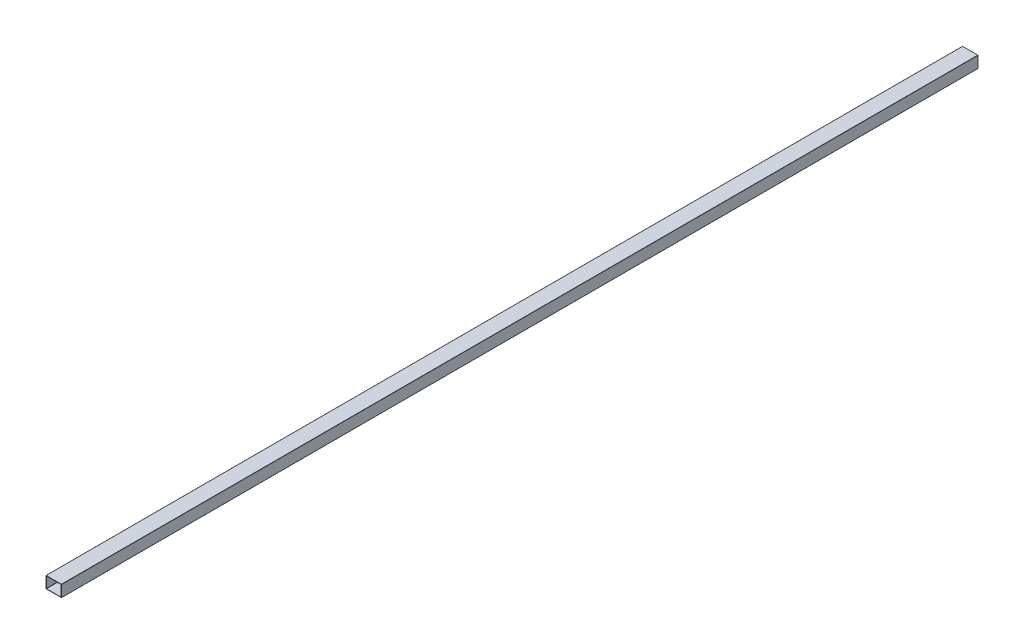
ISO-10303-21;
HEADER;
FILE_DESCRIPTION(('STEP AP214'),'2;1');
FILE_NAME('part.step','',(''),(''),'','','');
FILE_SCHEMA(('AUTOMOTIVE_DESIGN { 1 0 10303 214 1 1 1 1 }'));
ENDSEC;
DATA;
#1=APPLICATION_CONTEXT('core data for automotive mechanical design processes');
#2=APPLICATION_PROTOCOL_DEFINITION('international standard','automotive_design',2000,#1);
#3=PRODUCT_CONTEXT('',#1,'mechanical');
#4=PRODUCT('Part','Part','',(#3));
#5=PRODUCT_RELATED_PRODUCT_CATEGORY('part','',(#4));
#6=PRODUCT_DEFINITION_FORMATION('','',#4);
#7=PRODUCT_DEFINITION_CONTEXT('part definition',#1,'design');
#8=PRODUCT_DEFINITION('design','',#6,#7);
#9=PRODUCT_DEFINITION_SHAPE('','',#8);
#10=(LENGTH_UNIT() NAMED_UNIT(*) SI_UNIT(.MILLI.,.METRE.));
#11=(NAMED_UNIT(*) PLANE_ANGLE_UNIT() SI_UNIT($,.RADIAN.));
#12=(NAMED_UNIT(*) SI_UNIT($,.STERADIAN.) SOLID_ANGLE_UNIT());
#13=UNCERTAINTY_MEASURE_WITH_UNIT(LENGTH_MEASURE(1.E-05),#10,'distance_accuracy_value','');
#14=(GEOMETRIC_REPRESENTATION_CONTEXT(3) GLOBAL_UNCERTAINTY_ASSIGNED_CONTEXT((#13)) GLOBAL_UNIT_ASSIGNED_CONTEXT((#10,
#11,#12)) REPRESENTATION_CONTEXT('',''));
#15=CARTESIAN_POINT('',(0.,0.,0.));
#16=DIRECTION('',(0.,0.,1.));
#17=DIRECTION('',(1.,0.,0.));
#18=AXIS2_PLACEMENT_3D('',#15,#16,#17);
#19=CARTESIAN_POINT('',(50.8,-38.1,-6000.));
#20=DIRECTION('',(1.,0.,0.));
#21=DIRECTION('',(0.,0.,-1.));
#22=AXIS2_PLACEMENT_3D('',#19,#20,#21);
#23=PLANE('',#22);
#24=DIRECTION('',(0.,1.,0.));
#25=VECTOR('',#24,1.);
#26=CARTESIAN_POINT('',(50.8,-38.1,0.));
#27=LINE('',#26,#25);
#28=CARTESIAN_POINT('',(50.8,-37.1,0.));
#29=VERTEX_POINT('',#28);
#30=CARTESIAN_POINT('',(50.8,37.1,0.));
#31=VERTEX_POINT('',#30);
#32=EDGE_CURVE('E197',#29,#31,#27,.T.);
#33=ORIENTED_EDGE('',*,*,#32,.F.);
#34=DIRECTION('',(0.,0.,1.));
#35=VECTOR('',#34,1.);
#36=CARTESIAN_POINT('',(50.8,-37.1,-6000.));
#37=LINE('',#36,#35);
#38=CARTESIAN_POINT('',(50.8,-37.1,-6000.));
#39=VERTEX_POINT('',#38);
#40=EDGE_CURVE('E158',#29,#39,#37,.F.);
#41=ORIENTED_EDGE('',*,*,#40,.T.);
#42=DIRECTION('',(0.,1.,0.));
#43=VECTOR('',#42,1.);
#44=CARTESIAN_POINT('',(50.8,-38.1,-6000.));
#45=LINE('',#44,#43);
#46=CARTESIAN_POINT('',(50.8,37.1,-6000.));
#47=VERTEX_POINT('',#46);
#48=EDGE_CURVE('E185',#39,#47,#45,.T.);
#49=ORIENTED_EDGE('',*,*,#48,.T.);
#50=DIRECTION('',(0.,0.,1.));
#51=VECTOR('',#50,1.);
#52=CARTESIAN_POINT('',(50.8,37.1,-6000.));
#53=LINE('',#52,#51);
#54=EDGE_CURVE('E251',#47,#31,#53,.T.);
#55=ORIENTED_EDGE('',*,*,#54,.T.);
#56=EDGE_LOOP('',(#33,#41,#49,#55));
#57=FACE_BOUND('',#56,.T.);
#58=ADVANCED_FACE('F33',(#57),#23,.T.);
#59=CARTESIAN_POINT('',(-50.8,-38.1,-6000.));
#60=DIRECTION('',(0.,-1.,0.));
#61=DIRECTION('',(0.,0.,-1.));
#62=AXIS2_PLACEMENT_3D('',#59,#60,#61);
#63=PLANE('',#62);
#64=DIRECTION('',(1.,0.,0.));
#65=VECTOR('',#64,1.);
#66=CARTESIAN_POINT('',(-50.8,-38.1,0.));
#67=LINE('',#66,#65);
#68=CARTESIAN_POINT('',(-49.8,-38.1,0.));
#69=VERTEX_POINT('',#68);
#70=CARTESIAN_POINT('',(49.8,-38.1,0.));
#71=VERTEX_POINT('',#70);
#72=EDGE_CURVE('E189',#69,#71,#67,.T.);
#73=ORIENTED_EDGE('',*,*,#72,.F.);
#74=DIRECTION('',(0.,0.,1.));
#75=VECTOR('',#74,1.);
#76=CARTESIAN_POINT('',(-49.8,-38.1,-6000.));
#77=LINE('',#76,#75);
#78=CARTESIAN_POINT('',(-49.8,-38.1,-6000.));
#79=VERTEX_POINT('',#78);
#80=EDGE_CURVE('E238',#69,#79,#77,.F.);
#81=ORIENTED_EDGE('',*,*,#80,.T.);
#82=DIRECTION('',(1.,0.,0.));
#83=VECTOR('',#82,1.);
#84=CARTESIAN_POINT('',(-50.8,-38.1,-6000.));
#85=LINE('',#84,#83);
#86=CARTESIAN_POINT('',(49.8,-38.1,-6000.));
#87=VERTEX_POINT('',#86);
#88=EDGE_CURVE('E194',#79,#87,#85,.T.);
#89=ORIENTED_EDGE('',*,*,#88,.T.);
#90=DIRECTION('',(0.,0.,1.));
#91=VECTOR('',#90,1.);
#92=CARTESIAN_POINT('',(49.8,-38.1,-6000.));
#93=LINE('',#92,#91);
#94=EDGE_CURVE('E235',#87,#71,#93,.T.);
#95=ORIENTED_EDGE('',*,*,#94,.T.);
#96=EDGE_LOOP('',(#73,#81,#89,#95));
#97=FACE_BOUND('',#96,.T.);
#98=ADVANCED_FACE('F305',(#97),#63,.T.);
#99=CARTESIAN_POINT('',(-50.8,-38.1,-6000.));
#100=DIRECTION('',(-1.,0.,0.));
#101=DIRECTION('',(0.,0.,1.));
#102=AXIS2_PLACEMENT_3D('',#99,#100,#101);
#103=PLANE('',#102);
#104=DIRECTION('',(0.,-1.,0.));
#105=VECTOR('',#104,1.);
#106=CARTESIAN_POINT('',(-50.8,-38.1,-6000.));
#107=LINE('',#106,#105);
#108=CARTESIAN_POINT('',(-50.8,37.1,-6000.));
#109=VERTEX_POINT('',#108);
#110=CARTESIAN_POINT('',(-50.8,-37.1,-6000.));
#111=VERTEX_POINT('',#110);
#112=EDGE_CURVE('E191',#109,#111,#107,.T.);
#113=ORIENTED_EDGE('',*,*,#112,.T.);
#114=DIRECTION('',(0.,0.,1.));
#115=VECTOR('',#114,1.);
#116=CARTESIAN_POINT('',(-50.8,-37.1,-6000.));
#117=LINE('',#116,#115);
#118=CARTESIAN_POINT('',(-50.8,-37.1,0.));
#119=VERTEX_POINT('',#118);
#120=EDGE_CURVE('E224',#111,#119,#117,.T.);
#121=ORIENTED_EDGE('',*,*,#120,.T.);
#122=DIRECTION('',(0.,-1.,0.));
#123=VECTOR('',#122,1.);
#124=CARTESIAN_POINT('',(-50.8,-38.1,0.));
#125=LINE('',#124,#123);
#126=CARTESIAN_POINT('',(-50.8,37.1,0.));
#127=VERTEX_POINT('',#126);
#128=EDGE_CURVE('E203',#127,#119,#125,.T.);
#129=ORIENTED_EDGE('',*,*,#128,.F.);
#130=DIRECTION('',(0.,0.,1.));
#131=VECTOR('',#130,1.);
#132=CARTESIAN_POINT('',(-50.8,37.1,-6000.));
#133=LINE('',#132,#131);
#134=EDGE_CURVE('E222',#127,#109,#133,.F.);
#135=ORIENTED_EDGE('',*,*,#134,.T.);
#136=EDGE_LOOP('',(#113,#121,#129,#135));
#137=FACE_BOUND('',#136,.T.);
#138=ADVANCED_FACE('F311',(#137),#103,.T.);
#139=CARTESIAN_POINT('',(-50.8,38.1,-6000.));
#140=DIRECTION('',(0.,1.,0.));
#141=DIRECTION('',(0.,0.,1.));
#142=AXIS2_PLACEMENT_3D('',#139,#140,#141);
#143=PLANE('',#142);
#144=DIRECTION('',(-1.,0.,0.));
#145=VECTOR('',#144,1.);
#146=CARTESIAN_POINT('',(-50.8,38.1,-6000.));
#147=LINE('',#146,#145);
#148=CARTESIAN_POINT('',(49.8,38.1,-6000.));
#149=VERTEX_POINT('',#148);
#150=CARTESIAN_POINT('',(-49.8,38.1,-6000.));
#151=VERTEX_POINT('',#150);
#152=EDGE_CURVE('E188',#149,#151,#147,.T.);
#153=ORIENTED_EDGE('',*,*,#152,.T.);
#154=DIRECTION('',(0.,0.,1.));
#155=VECTOR('',#154,1.);
#156=CARTESIAN_POINT('',(-49.8,38.1,-6000.));
#157=LINE('',#156,#155);
#158=CARTESIAN_POINT('',(-49.8,38.1,0.));
#159=VERTEX_POINT('',#158);
#160=EDGE_CURVE('E248',#151,#159,#157,.T.);
#161=ORIENTED_EDGE('',*,*,#160,.T.);
#162=DIRECTION('',(-1.,0.,0.));
#163=VECTOR('',#162,1.);
#164=CARTESIAN_POINT('',(-50.8,38.1,0.));
#165=LINE('',#164,#163);
#166=CARTESIAN_POINT('',(49.8,38.1,0.));
#167=VERTEX_POINT('',#166);
#168=EDGE_CURVE('E200',#167,#159,#165,.T.);
#169=ORIENTED_EDGE('',*,*,#168,.F.);
#170=DIRECTION('',(0.,0.,1.));
#171=VECTOR('',#170,1.);
#172=CARTESIAN_POINT('',(49.8,38.1,-6000.));
#173=LINE('',#172,#171);
#174=EDGE_CURVE('E55',#167,#149,#173,.F.);
#175=ORIENTED_EDGE('',*,*,#174,.T.);
#176=EDGE_LOOP('',(#153,#161,#169,#175));
#177=FACE_BOUND('',#176,.T.);
#178=ADVANCED_FACE('F316',(#177),#143,.T.);
#179=CARTESIAN_POINT('',(0.,0.,-6000.));
#180=DIRECTION('',(0.,0.,-1.));
#181=DIRECTION('',(-1.,0.,0.));
#182=AXIS2_PLACEMENT_3D('',#179,#180,#181);
#183=PLANE('',#182);
#184=DIRECTION('',(0.,-1.,0.));
#185=VECTOR('',#184,1.);
#186=CARTESIAN_POINT('',(-48.91,-36.21,-6000.));
#187=LINE('',#186,#185);
#188=CARTESIAN_POINT('',(-48.91,35.21,-6000.));
#189=VERTEX_POINT('',#188);
#190=CARTESIAN_POINT('',(-48.91,-35.21,-6000.));
#191=VERTEX_POINT('',#190);
#192=EDGE_CURVE('E167',#189,#191,#187,.T.);
#193=ORIENTED_EDGE('',*,*,#192,.T.);
#194=CARTESIAN_POINT('',(-47.91,-35.21,-6000.));
#195=DIRECTION('',(0.,0.,-1.));
#196=DIRECTION('',(-1.,0.,0.));
#197=AXIS2_PLACEMENT_3D('',#194,#195,#196);
#198=CIRCLE('',#197,1.);
#199=CARTESIAN_POINT('',(-47.91,-36.21,-6000.));
#200=VERTEX_POINT('',#199);
#201=EDGE_CURVE('E11',#191,#200,#198,.F.);
#202=ORIENTED_EDGE('',*,*,#201,.T.);
#203=DIRECTION('',(1.,0.,0.));
#204=VECTOR('',#203,1.);
#205=CARTESIAN_POINT('',(-48.91,-36.21,-6000.));
#206=LINE('',#205,#204);
#207=CARTESIAN_POINT('',(47.91,-36.21,-6000.));
#208=VERTEX_POINT('',#207);
#209=EDGE_CURVE('E175',#200,#208,#206,.T.);
#210=ORIENTED_EDGE('',*,*,#209,.T.);
#211=CARTESIAN_POINT('',(47.91,-35.21,-6000.));
#212=DIRECTION('',(0.,0.,-1.));
#213=DIRECTION('',(-1.,0.,0.));
#214=AXIS2_PLACEMENT_3D('',#211,#212,#213);
#215=CIRCLE('',#214,1.);
#216=CARTESIAN_POINT('',(48.91,-35.21,-6000.));
#217=VERTEX_POINT('',#216);
#218=EDGE_CURVE('E262',#208,#217,#215,.F.);
#219=ORIENTED_EDGE('',*,*,#218,.T.);
#220=DIRECTION('',(0.,1.,0.));
#221=VECTOR('',#220,1.);
#222=CARTESIAN_POINT('',(48.91,-36.21,-6000.));
#223=LINE('',#222,#221);
#224=CARTESIAN_POINT('',(48.91,35.21,-6000.));
#225=VERTEX_POINT('',#224);
#226=EDGE_CURVE('E179',#217,#225,#223,.T.);
#227=ORIENTED_EDGE('',*,*,#226,.T.);
#228=CARTESIAN_POINT('',(47.91,35.21,-6000.));
#229=DIRECTION('',(0.,0.,-1.));
#230=DIRECTION('',(-1.,0.,0.));
#231=AXIS2_PLACEMENT_3D('',#228,#229,#230);
#232=CIRCLE('',#231,1.);
#233=CARTESIAN_POINT('',(47.91,36.21,-6000.));
#234=VERTEX_POINT('',#233);
#235=EDGE_CURVE('E258',#225,#234,#232,.F.);
#236=ORIENTED_EDGE('',*,*,#235,.T.);
#237=DIRECTION('',(-1.,0.,0.));
#238=VECTOR('',#237,1.);
#239=CARTESIAN_POINT('',(-48.91,36.21,-6000.));
#240=LINE('',#239,#238);
#241=CARTESIAN_POINT('',(-47.91,36.21,-6000.));
#242=VERTEX_POINT('',#241);
#243=EDGE_CURVE('E277',#234,#242,#240,.T.);
#244=ORIENTED_EDGE('',*,*,#243,.T.);
#245=CARTESIAN_POINT('',(-47.91,35.21,-6000.));
#246=DIRECTION('',(0.,0.,-1.));
#247=DIRECTION('',(-1.,0.,0.));
#248=AXIS2_PLACEMENT_3D('',#245,#246,#247);
#249=CIRCLE('',#248,1.);
#250=EDGE_CURVE('E157',#242,#189,#249,.F.);
#251=ORIENTED_EDGE('',*,*,#250,.T.);
#252=EDGE_LOOP('',(#193,#202,#210,#219,#227,#236,#244,#251));
#253=FACE_BOUND('',#252,.T.);
#254=ORIENTED_EDGE('',*,*,#88,.F.);
#255=CARTESIAN_POINT('',(-49.8,-37.1,-6000.));
#256=DIRECTION('',(0.,0.,-1.));
#257=DIRECTION('',(-1.,0.,0.));
#258=AXIS2_PLACEMENT_3D('',#255,#256,#257);
#259=CIRCLE('',#258,1.);
#260=EDGE_CURVE('E245',#79,#111,#259,.T.);
#261=ORIENTED_EDGE('',*,*,#260,.T.);
#262=ORIENTED_EDGE('',*,*,#112,.F.);
#263=CARTESIAN_POINT('',(-49.8,37.1,-6000.));
#264=DIRECTION('',(0.,0.,-1.));
#265=DIRECTION('',(-1.,0.,0.));
#266=AXIS2_PLACEMENT_3D('',#263,#264,#265);
#267=CIRCLE('',#266,1.);
#268=EDGE_CURVE('E48',#109,#151,#267,.T.);
#269=ORIENTED_EDGE('',*,*,#268,.T.);
#270=ORIENTED_EDGE('',*,*,#152,.F.);
#271=CARTESIAN_POINT('',(49.8,37.1,-6000.));
#272=DIRECTION('',(0.,0.,-1.));
#273=DIRECTION('',(-1.,0.,0.));
#274=AXIS2_PLACEMENT_3D('',#271,#272,#273);
#275=CIRCLE('',#274,1.);
#276=EDGE_CURVE('E240',#149,#47,#275,.T.);
#277=ORIENTED_EDGE('',*,*,#276,.T.);
#278=ORIENTED_EDGE('',*,*,#48,.F.);
#279=CARTESIAN_POINT('',(49.8,-37.1,-6000.));
#280=DIRECTION('',(0.,0.,-1.));
#281=DIRECTION('',(-1.,0.,0.));
#282=AXIS2_PLACEMENT_3D('',#279,#280,#281);
#283=CIRCLE('',#282,1.);
#284=EDGE_CURVE('E242',#39,#87,#283,.T.);
#285=ORIENTED_EDGE('',*,*,#284,.T.);
#286=EDGE_LOOP('',(#254,#261,#262,#269,#270,#277,#278,#285));
#287=FACE_BOUND('',#286,.T.);
#288=ADVANCED_FACE('F267',(#253,#287),#183,.T.);
#289=CARTESIAN_POINT('',(0.,0.,0.));
#290=DIRECTION('',(0.,0.,-1.));
#291=DIRECTION('',(-1.,0.,0.));
#292=AXIS2_PLACEMENT_3D('',#289,#290,#291);
#293=PLANE('',#292);
#294=DIRECTION('',(0.,1.,0.));
#295=VECTOR('',#294,1.);
#296=CARTESIAN_POINT('',(48.91,-36.21,0.));
#297=LINE('',#296,#295);
#298=CARTESIAN_POINT('',(48.91,-35.21,0.));
#299=VERTEX_POINT('',#298);
#300=CARTESIAN_POINT('',(48.91,35.21,0.));
#301=VERTEX_POINT('',#300);
#302=EDGE_CURVE('E181',#299,#301,#297,.T.);
#303=ORIENTED_EDGE('',*,*,#302,.F.);
#304=CARTESIAN_POINT('',(47.91,-35.21,0.));
#305=DIRECTION('',(0.,0.,-1.));
#306=DIRECTION('',(-1.,0.,0.));
#307=AXIS2_PLACEMENT_3D('',#304,#305,#306);
#308=CIRCLE('',#307,1.);
#309=CARTESIAN_POINT('',(47.91,-36.21,0.));
#310=VERTEX_POINT('',#309);
#311=EDGE_CURVE('E260',#299,#310,#308,.T.);
#312=ORIENTED_EDGE('',*,*,#311,.T.);
#313=DIRECTION('',(1.,0.,0.));
#314=VECTOR('',#313,1.);
#315=CARTESIAN_POINT('',(-48.91,-36.21,0.));
#316=LINE('',#315,#314);
#317=CARTESIAN_POINT('',(-47.91,-36.21,0.));
#318=VERTEX_POINT('',#317);
#319=EDGE_CURVE('E281',#318,#310,#316,.T.);
#320=ORIENTED_EDGE('',*,*,#319,.F.);
#321=CARTESIAN_POINT('',(-47.91,-35.21,0.));
#322=DIRECTION('',(0.,0.,-1.));
#323=DIRECTION('',(-1.,0.,0.));
#324=AXIS2_PLACEMENT_3D('',#321,#322,#323);
#325=CIRCLE('',#324,1.);
#326=CARTESIAN_POINT('',(-48.91,-35.21,0.));
#327=VERTEX_POINT('',#326);
#328=EDGE_CURVE('E41',#318,#327,#325,.T.);
#329=ORIENTED_EDGE('',*,*,#328,.T.);
#330=DIRECTION('',(0.,-1.,0.));
#331=VECTOR('',#330,1.);
#332=CARTESIAN_POINT('',(-48.91,-36.21,0.));
#333=LINE('',#332,#331);
#334=CARTESIAN_POINT('',(-48.91,35.21,0.));
#335=VERTEX_POINT('',#334);
#336=EDGE_CURVE('E164',#335,#327,#333,.T.);
#337=ORIENTED_EDGE('',*,*,#336,.F.);
#338=CARTESIAN_POINT('',(-47.91,35.21,0.));
#339=DIRECTION('',(0.,0.,-1.));
#340=DIRECTION('',(-1.,0.,0.));
#341=AXIS2_PLACEMENT_3D('',#338,#339,#340);
#342=CIRCLE('',#341,1.);
#343=CARTESIAN_POINT('',(-47.91,36.21,0.));
#344=VERTEX_POINT('',#343);
#345=EDGE_CURVE('E147',#335,#344,#342,.T.);
#346=ORIENTED_EDGE('',*,*,#345,.T.);
#347=DIRECTION('',(-1.,0.,0.));
#348=VECTOR('',#347,1.);
#349=CARTESIAN_POINT('',(-48.91,36.21,0.));
#350=LINE('',#349,#348);
#351=CARTESIAN_POINT('',(47.91,36.21,0.));
#352=VERTEX_POINT('',#351);
#353=EDGE_CURVE('E176',#352,#344,#350,.T.);
#354=ORIENTED_EDGE('',*,*,#353,.F.);
#355=CARTESIAN_POINT('',(47.91,35.21,0.));
#356=DIRECTION('',(0.,0.,-1.));
#357=DIRECTION('',(-1.,0.,0.));
#358=AXIS2_PLACEMENT_3D('',#355,#356,#357);
#359=CIRCLE('',#358,1.);
#360=EDGE_CURVE('E256',#352,#301,#359,.T.);
#361=ORIENTED_EDGE('',*,*,#360,.T.);
#362=EDGE_LOOP('',(#303,#312,#320,#329,#337,#346,#354,#361));
#363=FACE_BOUND('',#362,.T.);
#364=ORIENTED_EDGE('',*,*,#128,.T.);
#365=CARTESIAN_POINT('',(-49.8,-37.1,0.));
#366=DIRECTION('',(0.,0.,-1.));
#367=DIRECTION('',(-1.,0.,0.));
#368=AXIS2_PLACEMENT_3D('',#365,#366,#367);
#369=CIRCLE('',#368,1.);
#370=EDGE_CURVE('E233',#119,#69,#369,.F.);
#371=ORIENTED_EDGE('',*,*,#370,.T.);
#372=ORIENTED_EDGE('',*,*,#72,.T.);
#373=CARTESIAN_POINT('',(49.8,-37.1,0.));
#374=DIRECTION('',(0.,0.,-1.));
#375=DIRECTION('',(-1.,0.,0.));
#376=AXIS2_PLACEMENT_3D('',#373,#374,#375);
#377=CIRCLE('',#376,1.);
#378=EDGE_CURVE('E229',#71,#29,#377,.F.);
#379=ORIENTED_EDGE('',*,*,#378,.T.);
#380=ORIENTED_EDGE('',*,*,#32,.T.);
#381=CARTESIAN_POINT('',(49.8,37.1,0.));
#382=DIRECTION('',(0.,0.,-1.));
#383=DIRECTION('',(-1.,0.,0.));
#384=AXIS2_PLACEMENT_3D('',#381,#382,#383);
#385=CIRCLE('',#384,1.);
#386=EDGE_CURVE('E227',#31,#167,#385,.F.);
#387=ORIENTED_EDGE('',*,*,#386,.T.);
#388=ORIENTED_EDGE('',*,*,#168,.T.);
#389=CARTESIAN_POINT('',(-49.8,37.1,0.));
#390=DIRECTION('',(0.,0.,-1.));
#391=DIRECTION('',(-1.,0.,0.));
#392=AXIS2_PLACEMENT_3D('',#389,#390,#391);
#393=CIRCLE('',#392,1.);
#394=EDGE_CURVE('E231',#159,#127,#393,.F.);
#395=ORIENTED_EDGE('',*,*,#394,.T.);
#396=EDGE_LOOP('',(#364,#371,#372,#379,#380,#387,#388,#395));
#397=FACE_BOUND('',#396,.T.);
#398=ADVANCED_FACE('F172',(#363,#397),#293,.F.);
#399=CARTESIAN_POINT('',(-48.91,-36.21,-6000.));
#400=DIRECTION('',(0.,-1.,0.));
#401=DIRECTION('',(0.,0.,-1.));
#402=AXIS2_PLACEMENT_3D('',#399,#400,#401);
#403=PLANE('',#402);
#404=ORIENTED_EDGE('',*,*,#319,.T.);
#405=DIRECTION('',(0.,0.,1.));
#406=VECTOR('',#405,1.);
#407=CARTESIAN_POINT('',(47.91,-36.21,-6000.));
#408=LINE('',#407,#406);
#409=EDGE_CURVE('E220',#310,#208,#408,.F.);
#410=ORIENTED_EDGE('',*,*,#409,.T.);
#411=ORIENTED_EDGE('',*,*,#209,.F.);
#412=DIRECTION('',(0.,0.,1.));
#413=VECTOR('',#412,1.);
#414=CARTESIAN_POINT('',(-47.91,-36.21,0.));
#415=LINE('',#414,#413);
#416=EDGE_CURVE('E217',#200,#318,#415,.T.);
#417=ORIENTED_EDGE('',*,*,#416,.T.);
#418=EDGE_LOOP('',(#404,#410,#411,#417));
#419=FACE_BOUND('',#418,.T.);
#420=ADVANCED_FACE('F283',(#419),#403,.F.);
#421=CARTESIAN_POINT('',(-48.91,-36.21,-6000.));
#422=DIRECTION('',(-1.,0.,0.));
#423=DIRECTION('',(0.,0.,1.));
#424=AXIS2_PLACEMENT_3D('',#421,#422,#423);
#425=PLANE('',#424);
#426=ORIENTED_EDGE('',*,*,#192,.F.);
#427=DIRECTION('',(0.,0.,1.));
#428=VECTOR('',#427,1.);
#429=CARTESIAN_POINT('',(-48.91,35.21,0.));
#430=LINE('',#429,#428);
#431=EDGE_CURVE('E151',#189,#335,#430,.T.);
#432=ORIENTED_EDGE('',*,*,#431,.T.);
#433=ORIENTED_EDGE('',*,*,#336,.T.);
#434=DIRECTION('',(0.,0.,1.));
#435=VECTOR('',#434,1.);
#436=CARTESIAN_POINT('',(-48.91,-35.21,-6000.));
#437=LINE('',#436,#435);
#438=EDGE_CURVE('E169',#327,#191,#437,.F.);
#439=ORIENTED_EDGE('',*,*,#438,.T.);
#440=EDGE_LOOP('',(#426,#432,#433,#439));
#441=FACE_BOUND('',#440,.T.);
#442=ADVANCED_FACE('F163',(#441),#425,.F.);
#443=CARTESIAN_POINT('',(-48.91,36.21,-6000.));
#444=DIRECTION('',(0.,1.,0.));
#445=DIRECTION('',(-1.,0.,0.));
#446=AXIS2_PLACEMENT_3D('',#443,#444,#445);
#447=PLANE('',#446);
#448=ORIENTED_EDGE('',*,*,#353,.T.);
#449=DIRECTION('',(0.,0.,1.));
#450=VECTOR('',#449,1.);
#451=CARTESIAN_POINT('',(-47.91,36.21,-6000.));
#452=LINE('',#451,#450);
#453=EDGE_CURVE('E152',#344,#242,#452,.F.);
#454=ORIENTED_EDGE('',*,*,#453,.T.);
#455=ORIENTED_EDGE('',*,*,#243,.F.);
#456=DIRECTION('',(0.,0.,1.));
#457=VECTOR('',#456,1.);
#458=CARTESIAN_POINT('',(47.91,36.21,0.));
#459=LINE('',#458,#457);
#460=EDGE_CURVE('E168',#234,#352,#459,.T.);
#461=ORIENTED_EDGE('',*,*,#460,.T.);
#462=EDGE_LOOP('',(#448,#454,#455,#461));
#463=FACE_BOUND('',#462,.T.);
#464=ADVANCED_FACE('F292',(#463),#447,.F.);
#465=CARTESIAN_POINT('',(48.91,-36.21,-6000.));
#466=DIRECTION('',(1.,0.,0.));
#467=DIRECTION('',(0.,1.,0.));
#468=AXIS2_PLACEMENT_3D('',#465,#466,#467);
#469=PLANE('',#468);
#470=ORIENTED_EDGE('',*,*,#302,.T.);
#471=DIRECTION('',(0.,0.,1.));
#472=VECTOR('',#471,1.);
#473=CARTESIAN_POINT('',(48.91,35.21,-6000.));
#474=LINE('',#473,#472);
#475=EDGE_CURVE('E215',#301,#225,#474,.F.);
#476=ORIENTED_EDGE('',*,*,#475,.T.);
#477=ORIENTED_EDGE('',*,*,#226,.F.);
#478=DIRECTION('',(0.,0.,1.));
#479=VECTOR('',#478,1.);
#480=CARTESIAN_POINT('',(48.91,-35.21,0.));
#481=LINE('',#480,#479);
#482=EDGE_CURVE('E212',#217,#299,#481,.T.);
#483=ORIENTED_EDGE('',*,*,#482,.T.);
#484=EDGE_LOOP('',(#470,#476,#477,#483));
#485=FACE_BOUND('',#484,.T.);
#486=ADVANCED_FACE('F275',(#485),#469,.F.);
#487=CARTESIAN_POINT('',(-47.91,35.21,-6000.));
#488=DIRECTION('',(0.,0.,-1.));
#489=DIRECTION('',(-1.,0.,0.));
#490=AXIS2_PLACEMENT_3D('',#487,#488,#489);
#491=CYLINDRICAL_SURFACE('',#490,1.);
#492=ORIENTED_EDGE('',*,*,#250,.F.);
#493=ORIENTED_EDGE('',*,*,#453,.F.);
#494=ORIENTED_EDGE('',*,*,#345,.F.);
#495=ORIENTED_EDGE('',*,*,#431,.F.);
#496=EDGE_LOOP('',(#492,#493,#494,#495));
#497=FACE_BOUND('',#496,.T.);
#498=ADVANCED_FACE('F150',(#497),#491,.F.);
#499=CARTESIAN_POINT('',(47.91,35.21,-6000.));
#500=DIRECTION('',(0.,0.,-1.));
#501=DIRECTION('',(-1.,0.,0.));
#502=AXIS2_PLACEMENT_3D('',#499,#500,#501);
#503=CYLINDRICAL_SURFACE('',#502,1.);
#504=ORIENTED_EDGE('',*,*,#235,.F.);
#505=ORIENTED_EDGE('',*,*,#475,.F.);
#506=ORIENTED_EDGE('',*,*,#360,.F.);
#507=ORIENTED_EDGE('',*,*,#460,.F.);
#508=EDGE_LOOP('',(#504,#505,#506,#507));
#509=FACE_BOUND('',#508,.T.);
#510=ADVANCED_FACE('F294',(#509),#503,.F.);
#511=CARTESIAN_POINT('',(47.91,-35.21,-6000.));
#512=DIRECTION('',(0.,0.,-1.));
#513=DIRECTION('',(-1.,0.,0.));
#514=AXIS2_PLACEMENT_3D('',#511,#512,#513);
#515=CYLINDRICAL_SURFACE('',#514,1.);
#516=ORIENTED_EDGE('',*,*,#218,.F.);
#517=ORIENTED_EDGE('',*,*,#409,.F.);
#518=ORIENTED_EDGE('',*,*,#311,.F.);
#519=ORIENTED_EDGE('',*,*,#482,.F.);
#520=EDGE_LOOP('',(#516,#517,#518,#519));
#521=FACE_BOUND('',#520,.T.);
#522=ADVANCED_FACE('F279',(#521),#515,.F.);
#523=CARTESIAN_POINT('',(-49.8,-37.1,-6000.));
#524=DIRECTION('',(0.,0.,1.));
#525=DIRECTION('',(1.,0.,0.));
#526=AXIS2_PLACEMENT_3D('',#523,#524,#525);
#527=CYLINDRICAL_SURFACE('',#526,1.);
#528=ORIENTED_EDGE('',*,*,#260,.F.);
#529=ORIENTED_EDGE('',*,*,#80,.F.);
#530=ORIENTED_EDGE('',*,*,#370,.F.);
#531=ORIENTED_EDGE('',*,*,#120,.F.);
#532=EDGE_LOOP('',(#528,#529,#530,#531));
#533=FACE_BOUND('',#532,.T.);
#534=ADVANCED_FACE('F301',(#533),#527,.T.);
#535=CARTESIAN_POINT('',(-49.8,37.1,-6000.));
#536=DIRECTION('',(0.,0.,1.));
#537=DIRECTION('',(1.,0.,0.));
#538=AXIS2_PLACEMENT_3D('',#535,#536,#537);
#539=CYLINDRICAL_SURFACE('',#538,1.);
#540=ORIENTED_EDGE('',*,*,#268,.F.);
#541=ORIENTED_EDGE('',*,*,#134,.F.);
#542=ORIENTED_EDGE('',*,*,#394,.F.);
#543=ORIENTED_EDGE('',*,*,#160,.F.);
#544=EDGE_LOOP('',(#540,#541,#542,#543));
#545=FACE_BOUND('',#544,.T.);
#546=ADVANCED_FACE('F368',(#545),#539,.T.);
#547=CARTESIAN_POINT('',(-47.91,-35.21,-6000.));
#548=DIRECTION('',(0.,0.,-1.));
#549=DIRECTION('',(-1.,0.,0.));
#550=AXIS2_PLACEMENT_3D('',#547,#548,#549);
#551=CYLINDRICAL_SURFACE('',#550,1.);
#552=ORIENTED_EDGE('',*,*,#201,.F.);
#553=ORIENTED_EDGE('',*,*,#438,.F.);
#554=ORIENTED_EDGE('',*,*,#328,.F.);
#555=ORIENTED_EDGE('',*,*,#416,.F.);
#556=EDGE_LOOP('',(#552,#553,#554,#555));
#557=FACE_BOUND('',#556,.T.);
#558=ADVANCED_FACE('F378',(#557),#551,.F.);
#559=CARTESIAN_POINT('',(49.8,-37.1,-6000.));
#560=DIRECTION('',(0.,0.,1.));
#561=DIRECTION('',(1.,0.,0.));
#562=AXIS2_PLACEMENT_3D('',#559,#560,#561);
#563=CYLINDRICAL_SURFACE('',#562,1.);
#564=ORIENTED_EDGE('',*,*,#284,.F.);
#565=ORIENTED_EDGE('',*,*,#40,.F.);
#566=ORIENTED_EDGE('',*,*,#378,.F.);
#567=ORIENTED_EDGE('',*,*,#94,.F.);
#568=EDGE_LOOP('',(#564,#565,#566,#567));
#569=FACE_BOUND('',#568,.T.);
#570=ADVANCED_FACE('F388',(#569),#563,.T.);
#571=CARTESIAN_POINT('',(49.8,37.1,-6000.));
#572=DIRECTION('',(0.,0.,1.));
#573=DIRECTION('',(1.,0.,0.));
#574=AXIS2_PLACEMENT_3D('',#571,#572,#573);
#575=CYLINDRICAL_SURFACE('',#574,1.);
#576=ORIENTED_EDGE('',*,*,#276,.F.);
#577=ORIENTED_EDGE('',*,*,#174,.F.);
#578=ORIENTED_EDGE('',*,*,#386,.F.);
#579=ORIENTED_EDGE('',*,*,#54,.F.);
#580=EDGE_LOOP('',(#576,#577,#578,#579));
#581=FACE_BOUND('',#580,.T.);
#582=ADVANCED_FACE('F35',(#581),#575,.T.);
#583=CLOSED_SHELL('',(#58,#98,#138,#178,#288,#398,#420,#442,#464,#486,#498,#510,#522,#534,#546,
#558,#570,#582));
#584=MANIFOLD_SOLID_BREP('B2',#583);
#585=ADVANCED_BREP_SHAPE_REPRESENTATION('',(#18,#584),#14);
#586=SHAPE_DEFINITION_REPRESENTATION(#9,#585);
ENDSEC;
END-ISO-10303-21;
